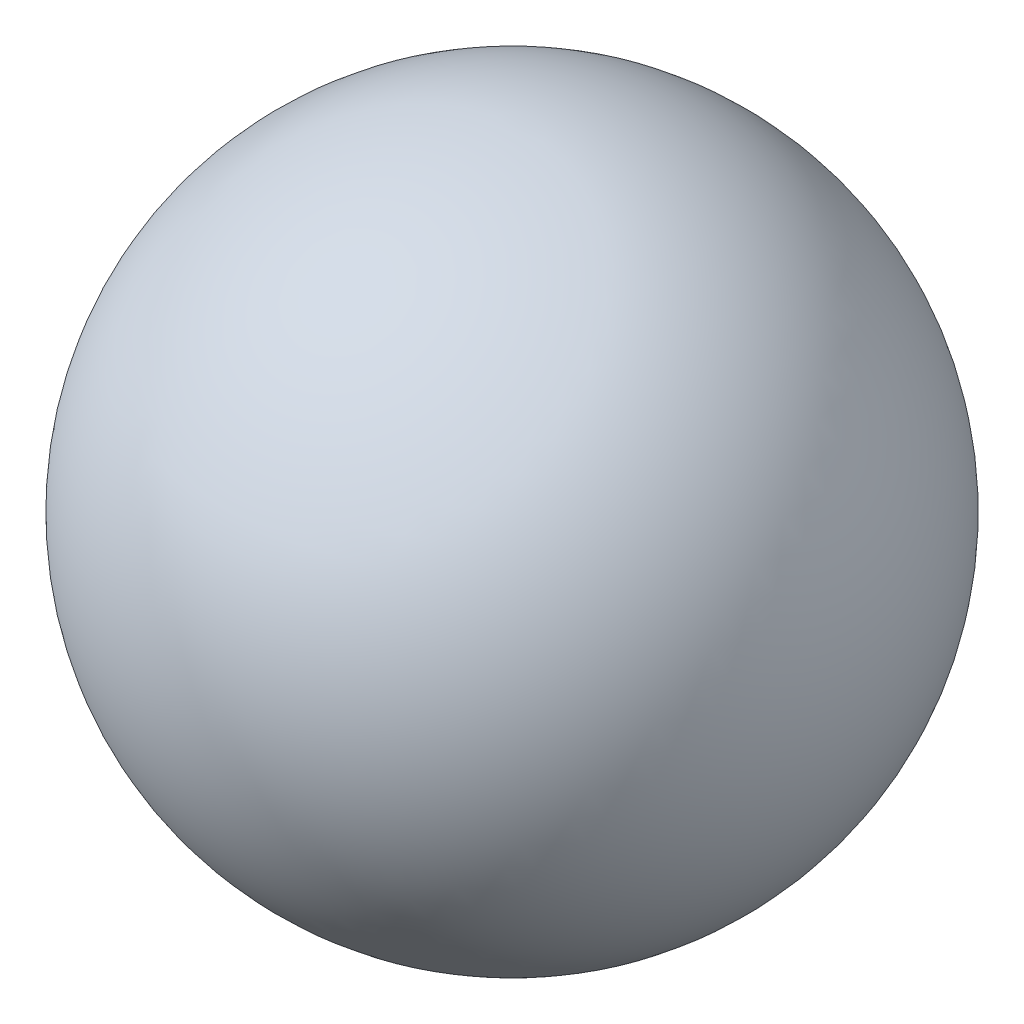
ISO-10303-21;
HEADER;
FILE_DESCRIPTION(('STEP AP214'),'2;1');
FILE_NAME('part.step','',(''),(''),'','','');
FILE_SCHEMA(('AUTOMOTIVE_DESIGN { 1 0 10303 214 1 1 1 1 }'));
ENDSEC;
DATA;
#1=APPLICATION_CONTEXT('core data for automotive mechanical design processes');
#2=APPLICATION_PROTOCOL_DEFINITION('international standard','automotive_design',2000,#1);
#3=PRODUCT_CONTEXT('',#1,'mechanical');
#4=PRODUCT('Part','Part','',(#3));
#5=PRODUCT_RELATED_PRODUCT_CATEGORY('part','',(#4));
#6=PRODUCT_DEFINITION_FORMATION('','',#4);
#7=PRODUCT_DEFINITION_CONTEXT('part definition',#1,'design');
#8=PRODUCT_DEFINITION('design','',#6,#7);
#9=PRODUCT_DEFINITION_SHAPE('','',#8);
#10=(LENGTH_UNIT() NAMED_UNIT(*) SI_UNIT(.MILLI.,.METRE.));
#11=(NAMED_UNIT(*) PLANE_ANGLE_UNIT() SI_UNIT($,.RADIAN.));
#12=(NAMED_UNIT(*) SI_UNIT($,.STERADIAN.) SOLID_ANGLE_UNIT());
#13=UNCERTAINTY_MEASURE_WITH_UNIT(LENGTH_MEASURE(1.E-05),#10,'distance_accuracy_value','');
#14=(GEOMETRIC_REPRESENTATION_CONTEXT(3) GLOBAL_UNCERTAINTY_ASSIGNED_CONTEXT((#13)) GLOBAL_UNIT_ASSIGNED_CONTEXT((#10,
#11,#12)) REPRESENTATION_CONTEXT('',''));
#15=CARTESIAN_POINT('',(0.,0.,0.));
#16=DIRECTION('',(0.,0.,1.));
#17=DIRECTION('',(1.,0.,0.));
#18=AXIS2_PLACEMENT_3D('',#15,#16,#17);
#19=CARTESIAN_POINT('',(0.,0.,0.));
#20=DIRECTION('',(0.,1.,0.));
#21=DIRECTION('',(-1.,0.,0.));
#22=AXIS2_PLACEMENT_3D('',#19,#20,#21);
#23=SPHERICAL_SURFACE('',#22,400.);
#24=CARTESIAN_POINT('',(0.,400.,0.));
#25=VERTEX_POINT('',#24);
#26=VERTEX_LOOP('',#25);
#27=FACE_BOUND('',#26,.T.);
#28=ADVANCED_FACE('F36',(#27),#23,.T.);
#29=CLOSED_SHELL('',(#28));
#30=CARTESIAN_POINT('',(0.,0.,0.));
#31=DIRECTION('',(0.,1.,0.));
#32=DIRECTION('',(1.,0.,0.));
#33=AXIS2_PLACEMENT_3D('',#30,#31,#32);
#34=SPHERICAL_SURFACE('',#33,300.);
#35=CARTESIAN_POINT('',(0.,300.,0.));
#36=VERTEX_POINT('',#35);
#37=VERTEX_LOOP('',#36);
#38=FACE_BOUND('',#37,.T.);
#39=ADVANCED_FACE('F38',(#38),#34,.F.);
#40=CLOSED_SHELL('',(#39));
#41=ORIENTED_CLOSED_SHELL('',*,#40,.T.);
#42=BREP_WITH_VOIDS('B2',#29,(#41));
#43=ADVANCED_BREP_SHAPE_REPRESENTATION('',(#18,#42),#14);
#44=SHAPE_DEFINITION_REPRESENTATION(#9,#43);
ENDSEC;
END-ISO-10303-21;
